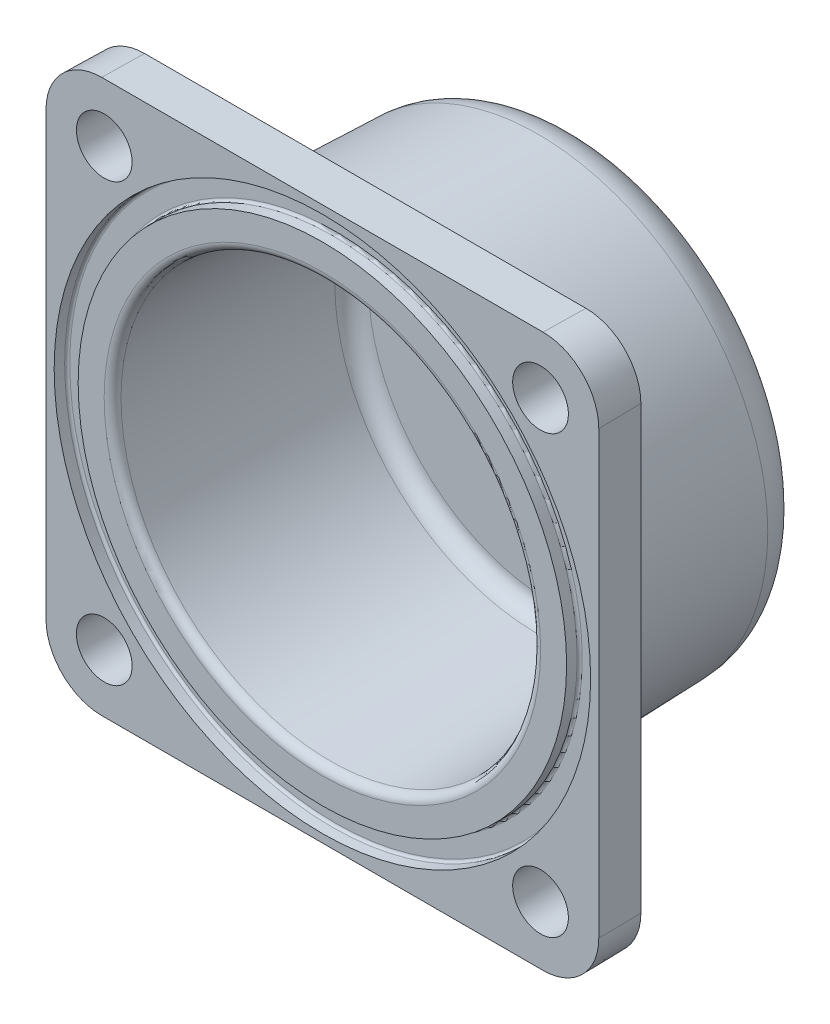
ISO-10303-21;
HEADER;
FILE_DESCRIPTION(('STEP AP214'),'2;1');
FILE_NAME('part.step','',(''),(''),'','','');
FILE_SCHEMA(('AUTOMOTIVE_DESIGN { 1 0 10303 214 1 1 1 1 }'));
ENDSEC;
DATA;
#1=APPLICATION_CONTEXT('core data for automotive mechanical design processes');
#2=APPLICATION_PROTOCOL_DEFINITION('international standard','automotive_design',2000,#1);
#3=PRODUCT_CONTEXT('',#1,'mechanical');
#4=PRODUCT('Part','Part','',(#3));
#5=PRODUCT_RELATED_PRODUCT_CATEGORY('part','',(#4));
#6=PRODUCT_DEFINITION_FORMATION('','',#4);
#7=PRODUCT_DEFINITION_CONTEXT('part definition',#1,'design');
#8=PRODUCT_DEFINITION('design','',#6,#7);
#9=PRODUCT_DEFINITION_SHAPE('','',#8);
#10=(LENGTH_UNIT() NAMED_UNIT(*) SI_UNIT(.MILLI.,.METRE.));
#11=(NAMED_UNIT(*) PLANE_ANGLE_UNIT() SI_UNIT($,.RADIAN.));
#12=(NAMED_UNIT(*) SI_UNIT($,.STERADIAN.) SOLID_ANGLE_UNIT());
#13=UNCERTAINTY_MEASURE_WITH_UNIT(LENGTH_MEASURE(1.E-05),#10,'distance_accuracy_value','');
#14=(GEOMETRIC_REPRESENTATION_CONTEXT(3) GLOBAL_UNCERTAINTY_ASSIGNED_CONTEXT((#13)) GLOBAL_UNIT_ASSIGNED_CONTEXT((#10,
#11,#12)) REPRESENTATION_CONTEXT('',''));
#15=CARTESIAN_POINT('',(0.,0.,0.));
#16=DIRECTION('',(0.,0.,1.));
#17=DIRECTION('',(1.,0.,0.));
#18=AXIS2_PLACEMENT_3D('',#15,#16,#17);
#19=CARTESIAN_POINT('',(-175.,0.,-128.2));
#20=DIRECTION('',(0.,0.,1.));
#21=DIRECTION('',(1.,0.,0.));
#22=AXIS2_PLACEMENT_3D('',#19,#20,#21);
#23=TOROIDAL_SURFACE('',#22,28.820991776327,0.3);
#24=CARTESIAN_POINT('',(-175.,0.,-128.205235721931));
#25=DIRECTION('',(0.,0.,1.));
#26=DIRECTION('',(-1.,0.,0.));
#27=AXIS2_PLACEMENT_3D('',#24,#25,#26);
#28=CIRCLE('',#27,28.5210374677801);
#29=CARTESIAN_POINT('',(-203.52103746778,0.,-128.205235721931));
#30=VERTEX_POINT('',#29);
#31=EDGE_CURVE('E791',#30,#30,#28,.T.);
#32=ORIENTED_EDGE('',*,*,#31,.F.);
#33=EDGE_LOOP('',(#32));
#34=FACE_BOUND('',#33,.T.);
#35=CARTESIAN_POINT('',(-175.,0.,-128.5));
#36=DIRECTION('',(0.,0.,-1.));
#37=DIRECTION('',(1.,0.,0.));
#38=AXIS2_PLACEMENT_3D('',#35,#36,#37);
#39=CIRCLE('',#38,28.8209916751746);
#40=CARTESIAN_POINT('',(-146.179008324825,0.,-128.5));
#41=VERTEX_POINT('',#40);
#42=EDGE_CURVE('E787',#41,#41,#39,.T.);
#43=ORIENTED_EDGE('',*,*,#42,.F.);
#44=EDGE_LOOP('',(#43));
#45=FACE_BOUND('',#44,.T.);
#46=ADVANCED_FACE('F17',(#34,#45),#23,.F.);
#47=CARTESIAN_POINT('',(-175.,0.,-127.));
#48=DIRECTION('',(0.,0.,-1.));
#49=DIRECTION('',(1.,0.,0.));
#50=AXIS2_PLACEMENT_3D('',#47,#48,#49);
#51=CONICAL_SURFACE('',#50,28.5,0.0174532925199543);
#52=CARTESIAN_POINT('',(-175.,0.,-127.));
#53=DIRECTION('',(0.,0.,1.));
#54=DIRECTION('',(1.,0.,0.));
#55=AXIS2_PLACEMENT_3D('',#52,#53,#54);
#56=CIRCLE('',#55,28.5);
#57=CARTESIAN_POINT('',(-146.5,0.,-127.));
#58=VERTEX_POINT('',#57);
#59=EDGE_CURVE('E783',#58,#58,#56,.T.);
#60=ORIENTED_EDGE('',*,*,#59,.F.);
#61=EDGE_LOOP('',(#60));
#62=FACE_BOUND('',#61,.T.);
#63=ORIENTED_EDGE('',*,*,#31,.T.);
#64=EDGE_LOOP('',(#63));
#65=FACE_BOUND('',#64,.T.);
#66=ADVANCED_FACE('F317',(#62,#65),#51,.T.);
#67=CARTESIAN_POINT('',(-175.,0.,-128.5));
#68=DIRECTION('',(0.,0.,1.));
#69=DIRECTION('',(1.,0.,0.));
#70=AXIS2_PLACEMENT_3D('',#67,#68,#69);
#71=PLANE('',#70);
#72=CARTESIAN_POINT('',(-175.,0.,-128.5));
#73=DIRECTION('',(0.,0.,1.));
#74=DIRECTION('',(1.,0.,0.));
#75=AXIS2_PLACEMENT_3D('',#72,#73,#74);
#76=CIRCLE('',#75,30.9790081225206);
#77=CARTESIAN_POINT('',(-144.020991877479,0.,-128.5));
#78=VERTEX_POINT('',#77);
#79=EDGE_CURVE('E779',#78,#78,#76,.T.);
#80=ORIENTED_EDGE('',*,*,#79,.T.);
#81=EDGE_LOOP('',(#80));
#82=FACE_BOUND('',#81,.T.);
#83=ORIENTED_EDGE('',*,*,#42,.T.);
#84=EDGE_LOOP('',(#83));
#85=FACE_BOUND('',#84,.T.);
#86=ADVANCED_FACE('F323',(#82,#85),#71,.T.);
#87=CARTESIAN_POINT('',(-175.,25.4656887748071,-127.));
#88=DIRECTION('',(0.,0.,1.));
#89=DIRECTION('',(1.,0.,0.));
#90=AXIS2_PLACEMENT_3D('',#87,#88,#89);
#91=PLANE('',#90);
#92=CARTESIAN_POINT('',(-175.,0.,-127.));
#93=DIRECTION('',(0.,0.,-1.));
#94=DIRECTION('',(-1.,0.,0.));
#95=AXIS2_PLACEMENT_3D('',#92,#93,#94);
#96=CIRCLE('',#95,25.4656887748071);
#97=CARTESIAN_POINT('',(-200.465688774807,0.,-127.));
#98=VERTEX_POINT('',#97);
#99=EDGE_CURVE('E775',#98,#98,#96,.T.);
#100=ORIENTED_EDGE('',*,*,#99,.T.);
#101=EDGE_LOOP('',(#100));
#102=FACE_BOUND('',#101,.T.);
#103=ORIENTED_EDGE('',*,*,#59,.T.);
#104=EDGE_LOOP('',(#103));
#105=FACE_BOUND('',#104,.T.);
#106=ADVANCED_FACE('F331',(#102,#105),#91,.T.);
#107=CARTESIAN_POINT('',(-175.,0.,-128.2));
#108=DIRECTION('',(0.,0.,1.));
#109=DIRECTION('',(1.,0.,0.));
#110=AXIS2_PLACEMENT_3D('',#107,#108,#109);
#111=TOROIDAL_SURFACE('',#110,30.979008223673,0.3);
#112=ORIENTED_EDGE('',*,*,#79,.F.);
#113=EDGE_LOOP('',(#112));
#114=FACE_BOUND('',#113,.T.);
#115=CARTESIAN_POINT('',(-175.,0.,-128.205235721931));
#116=DIRECTION('',(0.,0.,-1.));
#117=DIRECTION('',(-1.,0.,0.));
#118=AXIS2_PLACEMENT_3D('',#115,#116,#117);
#119=CIRCLE('',#118,31.2789625322199);
#120=CARTESIAN_POINT('',(-206.27896253222,0.,-128.205235721931));
#121=VERTEX_POINT('',#120);
#122=EDGE_CURVE('E771',#121,#121,#119,.T.);
#123=ORIENTED_EDGE('',*,*,#122,.F.);
#124=EDGE_LOOP('',(#123));
#125=FACE_BOUND('',#124,.T.);
#126=ADVANCED_FACE('F335',(#114,#125),#111,.F.);
#127=CARTESIAN_POINT('',(-175.,0.,-128.));
#128=DIRECTION('',(0.,0.,-1.));
#129=DIRECTION('',(-1.,0.,0.));
#130=AXIS2_PLACEMENT_3D('',#127,#128,#129);
#131=TOROIDAL_SURFACE('',#130,25.4656887748071,1.);
#132=CARTESIAN_POINT('',(-175.,0.,-127.965100503297));
#133=DIRECTION('',(0.,0.,-1.));
#134=DIRECTION('',(-1.,0.,0.));
#135=AXIS2_PLACEMENT_3D('',#132,#133,#134);
#136=CIRCLE('',#135,24.466297947788);
#137=CARTESIAN_POINT('',(-199.466297947788,0.,-127.965100503297));
#138=VERTEX_POINT('',#137);
#139=EDGE_CURVE('E767',#138,#138,#136,.T.);
#140=ORIENTED_EDGE('',*,*,#139,.T.);
#141=EDGE_LOOP('',(#140));
#142=FACE_BOUND('',#141,.T.);
#143=ORIENTED_EDGE('',*,*,#99,.F.);
#144=EDGE_LOOP('',(#143));
#145=FACE_BOUND('',#144,.T.);
#146=ADVANCED_FACE('F339',(#142,#145),#131,.T.);
#147=CARTESIAN_POINT('',(-175.,0.,-127.));
#148=DIRECTION('',(0.,0.,1.));
#149=DIRECTION('',(1.,0.,0.));
#150=AXIS2_PLACEMENT_3D('',#147,#148,#149);
#151=CONICAL_SURFACE('',#150,31.3,0.0174532925199543);
#152=ORIENTED_EDGE('',*,*,#122,.T.);
#153=EDGE_LOOP('',(#152));
#154=FACE_BOUND('',#153,.T.);
#155=CARTESIAN_POINT('',(-175.,0.,-127.));
#156=DIRECTION('',(0.,0.,1.));
#157=DIRECTION('',(1.,0.,0.));
#158=AXIS2_PLACEMENT_3D('',#155,#156,#157);
#159=CIRCLE('',#158,31.3);
#160=CARTESIAN_POINT('',(-143.7,0.,-127.));
#161=VERTEX_POINT('',#160);
#162=EDGE_CURVE('E738',#161,#161,#159,.T.);
#163=ORIENTED_EDGE('',*,*,#162,.T.);
#164=EDGE_LOOP('',(#163));
#165=FACE_BOUND('',#164,.T.);
#166=ADVANCED_FACE('F343',(#154,#165),#151,.F.);
#167=CARTESIAN_POINT('',(-175.,0.,-127.965100503297));
#168=DIRECTION('',(0.,0.,1.));
#169=DIRECTION('',(1.,0.,0.));
#170=AXIS2_PLACEMENT_3D('',#167,#168,#169);
#171=CONICAL_SURFACE('',#170,24.466297947788,0.0349065850398793);
#172=CARTESIAN_POINT('',(-175.,0.,-152.069798993405));
#173=DIRECTION('',(0.,0.,-1.));
#174=DIRECTION('',(-1.,0.,0.));
#175=AXIS2_PLACEMENT_3D('',#172,#173,#174);
#176=CIRCLE('',#175,23.6245433281468);
#177=CARTESIAN_POINT('',(-198.624543328147,0.,-152.069798993405));
#178=VERTEX_POINT('',#177);
#179=EDGE_CURVE('E761',#178,#178,#176,.T.);
#180=ORIENTED_EDGE('',*,*,#179,.T.);
#181=EDGE_LOOP('',(#180));
#182=FACE_BOUND('',#181,.T.);
#183=ORIENTED_EDGE('',*,*,#139,.F.);
#184=EDGE_LOOP('',(#183));
#185=FACE_BOUND('',#184,.T.);
#186=ADVANCED_FACE('F347',(#182,#185),#171,.F.);
#187=ORIENTED_EDGE('',*,*,#162,.F.);
#188=EDGE_LOOP('',(#187));
#189=FACE_BOUND('',#188,.T.);
#190=CARTESIAN_POINT('',(-149.544155877285,25.4558441227161,-127.));
#191=DIRECTION('',(0.,0.,1.));
#192=DIRECTION('',(1.,0.,0.));
#193=AXIS2_PLACEMENT_3D('',#190,#191,#192);
#194=CIRCLE('',#193,3.25);
#195=CARTESIAN_POINT('',(-146.294155877285,25.4558441227161,-127.));
#196=VERTEX_POINT('',#195);
#197=EDGE_CURVE('E742',#196,#196,#194,.T.);
#198=ORIENTED_EDGE('',*,*,#197,.F.);
#199=EDGE_LOOP('',(#198));
#200=FACE_BOUND('',#199,.T.);
#201=CARTESIAN_POINT('',(-149.544155877284,-25.4558441227154,-127.));
#202=DIRECTION('',(0.,0.,1.));
#203=DIRECTION('',(1.,0.,0.));
#204=AXIS2_PLACEMENT_3D('',#201,#202,#203);
#205=CIRCLE('',#204,3.25);
#206=CARTESIAN_POINT('',(-146.294155877284,-25.4558441227154,-127.));
#207=VERTEX_POINT('',#206);
#208=EDGE_CURVE('E746',#207,#207,#205,.T.);
#209=ORIENTED_EDGE('',*,*,#208,.F.);
#210=EDGE_LOOP('',(#209));
#211=FACE_BOUND('',#210,.T.);
#212=CARTESIAN_POINT('',(-200.455844122715,-25.4558441227159,-127.));
#213=DIRECTION('',(0.,0.,1.));
#214=DIRECTION('',(1.,0.,0.));
#215=AXIS2_PLACEMENT_3D('',#212,#213,#214);
#216=CIRCLE('',#215,3.25);
#217=CARTESIAN_POINT('',(-197.205844122715,-25.4558441227159,-127.));
#218=VERTEX_POINT('',#217);
#219=EDGE_CURVE('E118',#218,#218,#216,.T.);
#220=ORIENTED_EDGE('',*,*,#219,.F.);
#221=EDGE_LOOP('',(#220));
#222=FACE_BOUND('',#221,.T.);
#223=CARTESIAN_POINT('',(-200.455844122716,25.4558441227156,-127.));
#224=DIRECTION('',(0.,0.,1.));
#225=DIRECTION('',(1.,0.,0.));
#226=AXIS2_PLACEMENT_3D('',#223,#224,#225);
#227=CIRCLE('',#226,3.25);
#228=CARTESIAN_POINT('',(-197.205844122716,25.4558441227156,-127.));
#229=VERTEX_POINT('',#228);
#230=EDGE_CURVE('E111',#229,#229,#227,.T.);
#231=ORIENTED_EDGE('',*,*,#230,.F.);
#232=EDGE_LOOP('',(#231));
#233=FACE_BOUND('',#232,.T.);
#234=DIRECTION('',(-1.,0.,0.));
#235=VECTOR('',#234,1.);
#236=CARTESIAN_POINT('',(-149.25,32.25,-127.));
#237=LINE('',#236,#235);
#238=CARTESIAN_POINT('',(-149.25,32.25,-127.));
#239=VERTEX_POINT('',#238);
#240=CARTESIAN_POINT('',(-200.75,32.25,-127.));
#241=VERTEX_POINT('',#240);
#242=EDGE_CURVE('E94',#239,#241,#237,.T.);
#243=ORIENTED_EDGE('',*,*,#242,.T.);
#244=CARTESIAN_POINT('',(-200.75,25.75,-127.));
#245=DIRECTION('',(0.,0.,1.));
#246=DIRECTION('',(0.,1.,0.));
#247=AXIS2_PLACEMENT_3D('',#244,#245,#246);
#248=CIRCLE('',#247,6.5);
#249=CARTESIAN_POINT('',(-207.25,25.75,-127.));
#250=VERTEX_POINT('',#249);
#251=EDGE_CURVE('E82',#241,#250,#248,.T.);
#252=ORIENTED_EDGE('',*,*,#251,.T.);
#253=DIRECTION('',(0.,-1.,0.));
#254=VECTOR('',#253,1.);
#255=CARTESIAN_POINT('',(-207.25,25.75,-127.));
#256=LINE('',#255,#254);
#257=CARTESIAN_POINT('',(-207.25,-25.75,-127.));
#258=VERTEX_POINT('',#257);
#259=EDGE_CURVE('E93',#250,#258,#256,.T.);
#260=ORIENTED_EDGE('',*,*,#259,.T.);
#261=CARTESIAN_POINT('',(-200.75,-25.75,-127.));
#262=DIRECTION('',(0.,0.,1.));
#263=DIRECTION('',(-1.,0.,0.));
#264=AXIS2_PLACEMENT_3D('',#261,#262,#263);
#265=CIRCLE('',#264,6.5);
#266=CARTESIAN_POINT('',(-200.75,-32.25,-127.));
#267=VERTEX_POINT('',#266);
#268=EDGE_CURVE('E128',#258,#267,#265,.T.);
#269=ORIENTED_EDGE('',*,*,#268,.T.);
#270=DIRECTION('',(1.,0.,0.));
#271=VECTOR('',#270,1.);
#272=CARTESIAN_POINT('',(-200.75,-32.25,-127.));
#273=LINE('',#272,#271);
#274=CARTESIAN_POINT('',(-149.25,-32.25,-127.));
#275=VERTEX_POINT('',#274);
#276=EDGE_CURVE('E134',#267,#275,#273,.T.);
#277=ORIENTED_EDGE('',*,*,#276,.T.);
#278=CARTESIAN_POINT('',(-149.25,-25.75,-127.));
#279=DIRECTION('',(0.,0.,1.));
#280=DIRECTION('',(0.,-1.,0.));
#281=AXIS2_PLACEMENT_3D('',#278,#279,#280);
#282=CIRCLE('',#281,6.5);
#283=CARTESIAN_POINT('',(-142.75,-25.75,-127.));
#284=VERTEX_POINT('',#283);
#285=EDGE_CURVE('E140',#275,#284,#282,.T.);
#286=ORIENTED_EDGE('',*,*,#285,.T.);
#287=DIRECTION('',(0.,1.,0.));
#288=VECTOR('',#287,1.);
#289=CARTESIAN_POINT('',(-142.75,-25.75,-127.));
#290=LINE('',#289,#288);
#291=CARTESIAN_POINT('',(-142.75,25.75,-127.));
#292=VERTEX_POINT('',#291);
#293=EDGE_CURVE('E146',#284,#292,#290,.T.);
#294=ORIENTED_EDGE('',*,*,#293,.T.);
#295=CARTESIAN_POINT('',(-149.25,25.75,-127.));
#296=DIRECTION('',(0.,0.,1.));
#297=DIRECTION('',(1.,0.,0.));
#298=AXIS2_PLACEMENT_3D('',#295,#296,#297);
#299=CIRCLE('',#298,6.5);
#300=EDGE_CURVE('E109',#292,#239,#299,.T.);
#301=ORIENTED_EDGE('',*,*,#300,.T.);
#302=EDGE_LOOP('',(#243,#252,#260,#269,#277,#286,#294,#301));
#303=FACE_BOUND('',#302,.T.);
#304=ADVANCED_FACE('F107',(#189,#200,#211,#222,#233,#303),#91,.T.);
#305=CARTESIAN_POINT('',(-175.,0.,-152.));
#306=DIRECTION('',(0.,0.,-1.));
#307=DIRECTION('',(-1.,0.,0.));
#308=AXIS2_PLACEMENT_3D('',#305,#306,#307);
#309=TOROIDAL_SURFACE('',#308,21.6257616741087,2.);
#310=ORIENTED_EDGE('',*,*,#179,.F.);
#311=EDGE_LOOP('',(#310));
#312=FACE_BOUND('',#311,.T.);
#313=CARTESIAN_POINT('',(-175.,0.,-154.));
#314=DIRECTION('',(0.,0.,-1.));
#315=DIRECTION('',(-1.,0.,0.));
#316=AXIS2_PLACEMENT_3D('',#313,#314,#315);
#317=CIRCLE('',#316,21.6257616741087);
#318=CARTESIAN_POINT('',(-196.625761674109,0.,-154.));
#319=VERTEX_POINT('',#318);
#320=EDGE_CURVE('E155',#319,#319,#317,.T.);
#321=ORIENTED_EDGE('',*,*,#320,.T.);
#322=EDGE_LOOP('',(#321));
#323=FACE_BOUND('',#322,.T.);
#324=ADVANCED_FACE('F352',(#312,#323),#309,.F.);
#325=CARTESIAN_POINT('',(-149.544155877285,25.4558441227161,-127.));
#326=DIRECTION('',(0.,0.,1.));
#327=DIRECTION('',(1.,0.,0.));
#328=AXIS2_PLACEMENT_3D('',#325,#326,#327);
#329=CYLINDRICAL_SURFACE('',#328,3.25);
#330=CARTESIAN_POINT('',(-149.544155877285,25.4558441227161,-132.));
#331=DIRECTION('',(0.,0.,-1.));
#332=DIRECTION('',(-1.,0.,0.));
#333=AXIS2_PLACEMENT_3D('',#330,#331,#332);
#334=CIRCLE('',#333,3.25);
#335=CARTESIAN_POINT('',(-152.794155877285,25.4558441227161,-132.));
#336=VERTEX_POINT('',#335);
#337=EDGE_CURVE('E161',#336,#336,#334,.T.);
#338=ORIENTED_EDGE('',*,*,#337,.T.);
#339=EDGE_LOOP('',(#338));
#340=FACE_BOUND('',#339,.T.);
#341=ORIENTED_EDGE('',*,*,#197,.T.);
#342=EDGE_LOOP('',(#341));
#343=FACE_BOUND('',#342,.T.);
#344=ADVANCED_FACE('F355',(#340,#343),#329,.F.);
#345=CARTESIAN_POINT('',(-149.544155877284,-25.4558441227154,-127.));
#346=DIRECTION('',(0.,0.,1.));
#347=DIRECTION('',(1.,0.,0.));
#348=AXIS2_PLACEMENT_3D('',#345,#346,#347);
#349=CYLINDRICAL_SURFACE('',#348,3.25);
#350=CARTESIAN_POINT('',(-149.544155877284,-25.4558441227154,-132.));
#351=DIRECTION('',(0.,0.,-1.));
#352=DIRECTION('',(-1.,0.,0.));
#353=AXIS2_PLACEMENT_3D('',#350,#351,#352);
#354=CIRCLE('',#353,3.25);
#355=CARTESIAN_POINT('',(-152.794155877284,-25.4558441227154,-132.));
#356=VERTEX_POINT('',#355);
#357=EDGE_CURVE('E165',#356,#356,#354,.T.);
#358=ORIENTED_EDGE('',*,*,#357,.T.);
#359=EDGE_LOOP('',(#358));
#360=FACE_BOUND('',#359,.T.);
#361=ORIENTED_EDGE('',*,*,#208,.T.);
#362=EDGE_LOOP('',(#361));
#363=FACE_BOUND('',#362,.T.);
#364=ADVANCED_FACE('F359',(#360,#363),#349,.F.);
#365=CARTESIAN_POINT('',(-200.455844122715,-25.4558441227159,-127.));
#366=DIRECTION('',(0.,0.,1.));
#367=DIRECTION('',(1.,0.,0.));
#368=AXIS2_PLACEMENT_3D('',#365,#366,#367);
#369=CYLINDRICAL_SURFACE('',#368,3.25);
#370=CARTESIAN_POINT('',(-200.455844122715,-25.4558441227159,-132.));
#371=DIRECTION('',(0.,0.,-1.));
#372=DIRECTION('',(-1.,0.,0.));
#373=AXIS2_PLACEMENT_3D('',#370,#371,#372);
#374=CIRCLE('',#373,3.25);
#375=CARTESIAN_POINT('',(-203.705844122715,-25.4558441227159,-132.));
#376=VERTEX_POINT('',#375);
#377=EDGE_CURVE('E169',#376,#376,#374,.T.);
#378=ORIENTED_EDGE('',*,*,#377,.T.);
#379=EDGE_LOOP('',(#378));
#380=FACE_BOUND('',#379,.T.);
#381=ORIENTED_EDGE('',*,*,#219,.T.);
#382=EDGE_LOOP('',(#381));
#383=FACE_BOUND('',#382,.T.);
#384=ADVANCED_FACE('F363',(#380,#383),#369,.F.);
#385=CARTESIAN_POINT('',(-200.455844122716,25.4558441227156,-127.));
#386=DIRECTION('',(0.,0.,1.));
#387=DIRECTION('',(1.,0.,0.));
#388=AXIS2_PLACEMENT_3D('',#385,#386,#387);
#389=CYLINDRICAL_SURFACE('',#388,3.25);
#390=CARTESIAN_POINT('',(-200.455844122716,25.4558441227156,-132.));
#391=DIRECTION('',(0.,0.,-1.));
#392=DIRECTION('',(-1.,0.,0.));
#393=AXIS2_PLACEMENT_3D('',#390,#391,#392);
#394=CIRCLE('',#393,3.25);
#395=CARTESIAN_POINT('',(-203.705844122716,25.4558441227156,-132.));
#396=VERTEX_POINT('',#395);
#397=EDGE_CURVE('E104',#396,#396,#394,.T.);
#398=ORIENTED_EDGE('',*,*,#397,.T.);
#399=EDGE_LOOP('',(#398));
#400=FACE_BOUND('',#399,.T.);
#401=ORIENTED_EDGE('',*,*,#230,.T.);
#402=EDGE_LOOP('',(#401));
#403=FACE_BOUND('',#402,.T.);
#404=ADVANCED_FACE('F367',(#400,#403),#389,.F.);
#405=CARTESIAN_POINT('',(-149.25,32.25,-127.));
#406=DIRECTION('',(0.,0.999847695156391,-0.017452406437283));
#407=DIRECTION('',(0.,0.017452406437283,0.999847695156391));
#408=AXIS2_PLACEMENT_3D('',#405,#406,#407);
#409=PLANE('',#408);
#410=DIRECTION('',(0.,0.0174524064372827,0.999847695156391));
#411=VECTOR('',#410,1.);
#412=CARTESIAN_POINT('',(-200.75,32.1627246753589,-132.));
#413=LINE('',#412,#411);
#414=CARTESIAN_POINT('',(-200.75,32.1627246753589,-132.));
#415=VERTEX_POINT('',#414);
#416=EDGE_CURVE('E86',#415,#241,#413,.T.);
#417=ORIENTED_EDGE('',*,*,#416,.T.);
#418=ORIENTED_EDGE('',*,*,#242,.F.);
#419=DIRECTION('',(0.,0.0174524064372827,0.999847695156391));
#420=VECTOR('',#419,1.);
#421=CARTESIAN_POINT('',(-149.25,32.1627246753589,-132.));
#422=LINE('',#421,#420);
#423=CARTESIAN_POINT('',(-149.25,32.1627246753589,-132.));
#424=VERTEX_POINT('',#423);
#425=EDGE_CURVE('E103',#424,#239,#422,.T.);
#426=ORIENTED_EDGE('',*,*,#425,.F.);
#427=DIRECTION('',(1.,0.,0.));
#428=VECTOR('',#427,1.);
#429=CARTESIAN_POINT('',(-200.75,32.1627246753589,-132.));
#430=LINE('',#429,#428);
#431=EDGE_CURVE('E101',#415,#424,#430,.T.);
#432=ORIENTED_EDGE('',*,*,#431,.F.);
#433=EDGE_LOOP('',(#417,#418,#426,#432));
#434=FACE_BOUND('',#433,.T.);
#435=ADVANCED_FACE('F99',(#434),#409,.T.);
#436=CARTESIAN_POINT('',(-200.75,25.75,-127.));
#437=DIRECTION('',(0.,0.,1.));
#438=DIRECTION('',(1.,0.,0.));
#439=AXIS2_PLACEMENT_3D('',#436,#437,#438);
#440=CONICAL_SURFACE('',#439,6.5,0.0174532925199543);
#441=DIRECTION('',(-0.0174524064372855,0.,0.999847695156391));
#442=VECTOR('',#441,1.);
#443=CARTESIAN_POINT('',(-207.162724675359,25.75,-132.));
#444=LINE('',#443,#442);
#445=CARTESIAN_POINT('',(-207.162724675359,25.75,-132.));
#446=VERTEX_POINT('',#445);
#447=EDGE_CURVE('E88',#446,#250,#444,.T.);
#448=ORIENTED_EDGE('',*,*,#447,.T.);
#449=ORIENTED_EDGE('',*,*,#251,.F.);
#450=ORIENTED_EDGE('',*,*,#416,.F.);
#451=CARTESIAN_POINT('',(-200.75,25.75,-132.));
#452=DIRECTION('',(0.,0.,-1.));
#453=DIRECTION('',(-1.,0.,0.));
#454=AXIS2_PLACEMENT_3D('',#451,#452,#453);
#455=CIRCLE('',#454,6.41272467535886);
#456=EDGE_CURVE('E188',#446,#415,#455,.T.);
#457=ORIENTED_EDGE('',*,*,#456,.F.);
#458=EDGE_LOOP('',(#448,#449,#450,#457));
#459=FACE_BOUND('',#458,.T.);
#460=ADVANCED_FACE('F84',(#459),#440,.T.);
#461=CARTESIAN_POINT('',(-207.25,25.75,-127.));
#462=DIRECTION('',(-0.999847695156391,0.,-0.0174524064372835));
#463=DIRECTION('',(-0.0174524064372835,0.,0.999847695156391));
#464=AXIS2_PLACEMENT_3D('',#461,#462,#463);
#465=PLANE('',#464);
#466=DIRECTION('',(-0.0174524064372855,0.,0.999847695156391));
#467=VECTOR('',#466,1.);
#468=CARTESIAN_POINT('',(-207.162724675359,-25.75,-132.));
#469=LINE('',#468,#467);
#470=CARTESIAN_POINT('',(-207.162724675359,-25.75,-132.));
#471=VERTEX_POINT('',#470);
#472=EDGE_CURVE('E193',#471,#258,#469,.T.);
#473=ORIENTED_EDGE('',*,*,#472,.T.);
#474=ORIENTED_EDGE('',*,*,#259,.F.);
#475=ORIENTED_EDGE('',*,*,#447,.F.);
#476=DIRECTION('',(0.,1.,0.));
#477=VECTOR('',#476,1.);
#478=CARTESIAN_POINT('',(-207.162724675359,-25.75,-132.));
#479=LINE('',#478,#477);
#480=EDGE_CURVE('E199',#471,#446,#479,.T.);
#481=ORIENTED_EDGE('',*,*,#480,.F.);
#482=EDGE_LOOP('',(#473,#474,#475,#481));
#483=FACE_BOUND('',#482,.T.);
#484=ADVANCED_FACE('F290',(#483),#465,.T.);
#485=CARTESIAN_POINT('',(-200.75,-25.75,-127.));
#486=DIRECTION('',(0.,0.,1.));
#487=DIRECTION('',(1.,0.,0.));
#488=AXIS2_PLACEMENT_3D('',#485,#486,#487);
#489=CONICAL_SURFACE('',#488,6.5,0.0174532925199543);
#490=DIRECTION('',(0.,-0.0174524064372841,0.999847695156391));
#491=VECTOR('',#490,1.);
#492=CARTESIAN_POINT('',(-200.75,-32.1627246753589,-132.));
#493=LINE('',#492,#491);
#494=CARTESIAN_POINT('',(-200.75,-32.1627246753589,-132.));
#495=VERTEX_POINT('',#494);
#496=EDGE_CURVE('E204',#495,#267,#493,.T.);
#497=ORIENTED_EDGE('',*,*,#496,.T.);
#498=ORIENTED_EDGE('',*,*,#268,.F.);
#499=ORIENTED_EDGE('',*,*,#472,.F.);
#500=CARTESIAN_POINT('',(-200.75,-25.75,-132.));
#501=DIRECTION('',(0.,0.,-1.));
#502=DIRECTION('',(0.,-1.,0.));
#503=AXIS2_PLACEMENT_3D('',#500,#501,#502);
#504=CIRCLE('',#503,6.41272467535886);
#505=EDGE_CURVE('E210',#495,#471,#504,.T.);
#506=ORIENTED_EDGE('',*,*,#505,.F.);
#507=EDGE_LOOP('',(#497,#498,#499,#506));
#508=FACE_BOUND('',#507,.T.);
#509=ADVANCED_FACE('F292',(#508),#489,.T.);
#510=CARTESIAN_POINT('',(-149.25,-32.25,-127.));
#511=DIRECTION('',(0.,-0.999847695156391,-0.0174524064372841));
#512=DIRECTION('',(0.,0.0174524064372841,-0.999847695156391));
#513=AXIS2_PLACEMENT_3D('',#510,#511,#512);
#514=PLANE('',#513);
#515=DIRECTION('',(0.,-0.0174524064372841,0.999847695156391));
#516=VECTOR('',#515,1.);
#517=CARTESIAN_POINT('',(-149.25,-32.1627246753589,-132.));
#518=LINE('',#517,#516);
#519=CARTESIAN_POINT('',(-149.25,-32.1627246753589,-132.));
#520=VERTEX_POINT('',#519);
#521=EDGE_CURVE('E215',#520,#275,#518,.T.);
#522=ORIENTED_EDGE('',*,*,#521,.T.);
#523=ORIENTED_EDGE('',*,*,#276,.F.);
#524=ORIENTED_EDGE('',*,*,#496,.F.);
#525=DIRECTION('',(-1.,0.,0.));
#526=VECTOR('',#525,1.);
#527=CARTESIAN_POINT('',(-149.25,-32.1627246753589,-132.));
#528=LINE('',#527,#526);
#529=EDGE_CURVE('E221',#520,#495,#528,.T.);
#530=ORIENTED_EDGE('',*,*,#529,.F.);
#531=EDGE_LOOP('',(#522,#523,#524,#530));
#532=FACE_BOUND('',#531,.T.);
#533=ADVANCED_FACE('F296',(#532),#514,.T.);
#534=CARTESIAN_POINT('',(-149.25,-25.75,-127.));
#535=DIRECTION('',(0.,0.,1.));
#536=DIRECTION('',(-1.,0.,0.));
#537=AXIS2_PLACEMENT_3D('',#534,#535,#536);
#538=CONICAL_SURFACE('',#537,6.5,0.0174532925199543);
#539=DIRECTION('',(0.0174524064372855,0.,0.999847695156391));
#540=VECTOR('',#539,1.);
#541=CARTESIAN_POINT('',(-142.837275324641,-25.75,-132.));
#542=LINE('',#541,#540);
#543=CARTESIAN_POINT('',(-142.837275324641,-25.75,-132.));
#544=VERTEX_POINT('',#543);
#545=EDGE_CURVE('E226',#544,#284,#542,.T.);
#546=ORIENTED_EDGE('',*,*,#545,.T.);
#547=ORIENTED_EDGE('',*,*,#285,.F.);
#548=ORIENTED_EDGE('',*,*,#521,.F.);
#549=CARTESIAN_POINT('',(-149.25,-25.75,-132.));
#550=DIRECTION('',(0.,0.,-1.));
#551=DIRECTION('',(1.,0.,0.));
#552=AXIS2_PLACEMENT_3D('',#549,#550,#551);
#553=CIRCLE('',#552,6.41272467535886);
#554=EDGE_CURVE('E232',#544,#520,#553,.T.);
#555=ORIENTED_EDGE('',*,*,#554,.F.);
#556=EDGE_LOOP('',(#546,#547,#548,#555));
#557=FACE_BOUND('',#556,.T.);
#558=ADVANCED_FACE('F299',(#557),#538,.T.);
#559=CARTESIAN_POINT('',(-142.75,25.75,-127.));
#560=DIRECTION('',(0.999847695156391,0.,-0.0174524064372835));
#561=DIRECTION('',(-0.0174524064372835,0.,-0.999847695156391));
#562=AXIS2_PLACEMENT_3D('',#559,#560,#561);
#563=PLANE('',#562);
#564=DIRECTION('',(0.0174524064372855,0.,0.999847695156391));
#565=VECTOR('',#564,1.);
#566=CARTESIAN_POINT('',(-142.837275324641,25.75,-132.));
#567=LINE('',#566,#565);
#568=CARTESIAN_POINT('',(-142.837275324641,25.75,-132.));
#569=VERTEX_POINT('',#568);
#570=EDGE_CURVE('E237',#569,#292,#567,.T.);
#571=ORIENTED_EDGE('',*,*,#570,.T.);
#572=ORIENTED_EDGE('',*,*,#293,.F.);
#573=ORIENTED_EDGE('',*,*,#545,.F.);
#574=DIRECTION('',(0.,-1.,0.));
#575=VECTOR('',#574,1.);
#576=CARTESIAN_POINT('',(-142.837275324641,25.75,-132.));
#577=LINE('',#576,#575);
#578=EDGE_CURVE('E37',#569,#544,#577,.T.);
#579=ORIENTED_EDGE('',*,*,#578,.F.);
#580=EDGE_LOOP('',(#571,#572,#573,#579));
#581=FACE_BOUND('',#580,.T.);
#582=ADVANCED_FACE('F302',(#581),#563,.T.);
#583=CARTESIAN_POINT('',(-149.25,25.75,-127.));
#584=DIRECTION('',(0.,0.,1.));
#585=DIRECTION('',(1.,0.,0.));
#586=AXIS2_PLACEMENT_3D('',#583,#584,#585);
#587=CONICAL_SURFACE('',#586,6.5,0.0174532925199543);
#588=ORIENTED_EDGE('',*,*,#425,.T.);
#589=ORIENTED_EDGE('',*,*,#300,.F.);
#590=ORIENTED_EDGE('',*,*,#570,.F.);
#591=CARTESIAN_POINT('',(-149.25,25.75,-132.));
#592=DIRECTION('',(0.,0.,-1.));
#593=DIRECTION('',(0.,1.,0.));
#594=AXIS2_PLACEMENT_3D('',#591,#592,#593);
#595=CIRCLE('',#594,6.41272467535886);
#596=EDGE_CURVE('E33',#424,#569,#595,.T.);
#597=ORIENTED_EDGE('',*,*,#596,.F.);
#598=EDGE_LOOP('',(#588,#589,#590,#597));
#599=FACE_BOUND('',#598,.T.);
#600=ADVANCED_FACE('F305',(#599),#587,.T.);
#601=CARTESIAN_POINT('',(-175.,0.,-154.));
#602=DIRECTION('',(0.,0.,1.));
#603=DIRECTION('',(1.,0.,0.));
#604=AXIS2_PLACEMENT_3D('',#601,#602,#603);
#605=PLANE('',#604);
#606=ORIENTED_EDGE('',*,*,#320,.F.);
#607=EDGE_LOOP('',(#606));
#608=FACE_BOUND('',#607,.T.);
#609=ADVANCED_FACE('F283',(#608),#605,.T.);
#610=CARTESIAN_POINT('',(-175.,30.3970663244212,-132.));
#611=DIRECTION('',(0.,0.,-1.));
#612=DIRECTION('',(-1.,0.,0.));
#613=AXIS2_PLACEMENT_3D('',#610,#611,#612);
#614=PLANE('',#613);
#615=ORIENTED_EDGE('',*,*,#337,.F.);
#616=EDGE_LOOP('',(#615));
#617=FACE_BOUND('',#616,.T.);
#618=ORIENTED_EDGE('',*,*,#357,.F.);
#619=EDGE_LOOP('',(#618));
#620=FACE_BOUND('',#619,.T.);
#621=ORIENTED_EDGE('',*,*,#377,.F.);
#622=EDGE_LOOP('',(#621));
#623=FACE_BOUND('',#622,.T.);
#624=ORIENTED_EDGE('',*,*,#397,.F.);
#625=EDGE_LOOP('',(#624));
#626=FACE_BOUND('',#625,.T.);
#627=CARTESIAN_POINT('',(-175.,0.,-132.));
#628=DIRECTION('',(0.,0.,-1.));
#629=DIRECTION('',(-1.,0.,0.));
#630=AXIS2_PLACEMENT_3D('',#627,#628,#629);
#631=CIRCLE('',#630,30.3970663244212);
#632=CARTESIAN_POINT('',(-205.397066324421,0.,-132.));
#633=VERTEX_POINT('',#632);
#634=EDGE_CURVE('E251',#633,#633,#631,.T.);
#635=ORIENTED_EDGE('',*,*,#634,.F.);
#636=EDGE_LOOP('',(#635));
#637=FACE_BOUND('',#636,.T.);
#638=ORIENTED_EDGE('',*,*,#480,.T.);
#639=ORIENTED_EDGE('',*,*,#456,.T.);
#640=ORIENTED_EDGE('',*,*,#431,.T.);
#641=ORIENTED_EDGE('',*,*,#596,.T.);
#642=ORIENTED_EDGE('',*,*,#578,.T.);
#643=ORIENTED_EDGE('',*,*,#554,.T.);
#644=ORIENTED_EDGE('',*,*,#529,.T.);
#645=ORIENTED_EDGE('',*,*,#505,.T.);
#646=EDGE_LOOP('',(#638,#639,#640,#641,#642,#643,#644,#645));
#647=FACE_BOUND('',#646,.T.);
#648=ADVANCED_FACE('F278',(#617,#620,#623,#626,#637,#647),#614,.T.);
#649=CARTESIAN_POINT('',(-175.,0.,-135.));
#650=DIRECTION('',(0.,0.,-1.));
#651=DIRECTION('',(-1.,0.,0.));
#652=AXIS2_PLACEMENT_3D('',#649,#650,#651);
#653=TOROIDAL_SURFACE('',#652,30.3970663244212,3.);
#654=CARTESIAN_POINT('',(-175.,0.,-134.895301509892));
#655=DIRECTION('',(0.,0.,-1.));
#656=DIRECTION('',(-1.,0.,0.));
#657=AXIS2_PLACEMENT_3D('',#654,#655,#656);
#658=CIRCLE('',#657,27.3988938433639);
#659=CARTESIAN_POINT('',(-202.398893843364,0.,-134.895301509892));
#660=VERTEX_POINT('',#659);
#661=EDGE_CURVE('E257',#660,#660,#658,.T.);
#662=ORIENTED_EDGE('',*,*,#661,.F.);
#663=EDGE_LOOP('',(#662));
#664=FACE_BOUND('',#663,.T.);
#665=ORIENTED_EDGE('',*,*,#634,.T.);
#666=EDGE_LOOP('',(#665));
#667=FACE_BOUND('',#666,.T.);
#668=ADVANCED_FACE('F272',(#664,#667),#653,.F.);
#669=CARTESIAN_POINT('',(-175.,0.,-152.174497483513));
#670=DIRECTION('',(0.,0.,1.));
#671=DIRECTION('',(1.,0.,0.));
#672=AXIS2_PLACEMENT_3D('',#669,#670,#671);
#673=CONICAL_SURFACE('',#672,26.7954910237664,0.0349065850398793);
#674=CARTESIAN_POINT('',(-175.,0.,-152.174497483513));
#675=DIRECTION('',(0.,0.,-1.));
#676=DIRECTION('',(-1.,0.,0.));
#677=AXIS2_PLACEMENT_3D('',#674,#675,#676);
#678=CIRCLE('',#677,26.7954910237664);
#679=CARTESIAN_POINT('',(-201.795491023766,0.,-152.174497483513));
#680=VERTEX_POINT('',#679);
#681=EDGE_CURVE('E26',#680,#680,#678,.T.);
#682=ORIENTED_EDGE('',*,*,#681,.F.);
#683=EDGE_LOOP('',(#682));
#684=FACE_BOUND('',#683,.T.);
#685=ORIENTED_EDGE('',*,*,#661,.T.);
#686=EDGE_LOOP('',(#685));
#687=FACE_BOUND('',#686,.T.);
#688=ADVANCED_FACE('F269',(#684,#687),#673,.T.);
#689=CARTESIAN_POINT('',(-175.,0.,-152.));
#690=DIRECTION('',(0.,0.,-1.));
#691=DIRECTION('',(-1.,0.,0.));
#692=AXIS2_PLACEMENT_3D('',#689,#690,#691);
#693=TOROIDAL_SURFACE('',#692,21.7985368886709,5.);
#694=ORIENTED_EDGE('',*,*,#681,.T.);
#695=EDGE_LOOP('',(#694));
#696=FACE_BOUND('',#695,.T.);
#697=CARTESIAN_POINT('',(-175.,0.,-157.));
#698=DIRECTION('',(0.,0.,-1.));
#699=DIRECTION('',(-1.,0.,0.));
#700=AXIS2_PLACEMENT_3D('',#697,#698,#699);
#701=CIRCLE('',#700,21.7985368886709);
#702=CARTESIAN_POINT('',(-196.798536888671,0.,-157.));
#703=VERTEX_POINT('',#702);
#704=EDGE_CURVE('E11',#703,#703,#701,.T.);
#705=ORIENTED_EDGE('',*,*,#704,.F.);
#706=EDGE_LOOP('',(#705));
#707=FACE_BOUND('',#706,.T.);
#708=ADVANCED_FACE('F266',(#696,#707),#693,.T.);
#709=CARTESIAN_POINT('',(-175.,21.7985368886709,-157.));
#710=DIRECTION('',(0.,0.,-1.));
#711=DIRECTION('',(-1.,0.,0.));
#712=AXIS2_PLACEMENT_3D('',#709,#710,#711);
#713=PLANE('',#712);
#714=ORIENTED_EDGE('',*,*,#704,.T.);
#715=EDGE_LOOP('',(#714));
#716=FACE_BOUND('',#715,.T.);
#717=ADVANCED_FACE('F19',(#716),#713,.T.);
#718=CLOSED_SHELL('',(#46,#66,#86,#106,#126,#146,#166,#186,#304,#324,#344,#364,#384,#404,#435,
#460,#484,#509,#533,#558,#582,#600,#609,#648,#668,#688,#708,#717));
#719=MANIFOLD_SOLID_BREP('B1',#718);
#720=ADVANCED_BREP_SHAPE_REPRESENTATION('',(#18,#719),#14);
#721=SHAPE_DEFINITION_REPRESENTATION(#9,#720);
ENDSEC;
END-ISO-10303-21;
